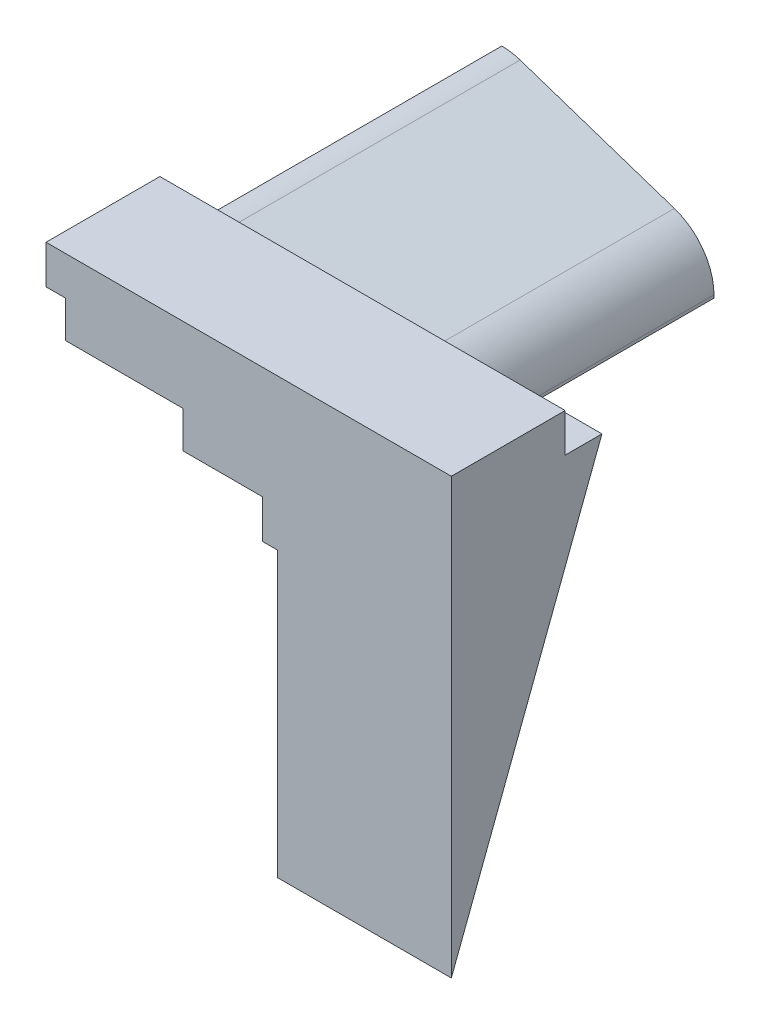
ISO-10303-21;
HEADER;
FILE_DESCRIPTION(('STEP AP214'),'2;1');
FILE_NAME('part.step','',(''),(''),'','','');
FILE_SCHEMA(('AUTOMOTIVE_DESIGN { 1 0 10303 214 1 1 1 1 }'));
ENDSEC;
DATA;
#1=APPLICATION_CONTEXT('core data for automotive mechanical design processes');
#2=APPLICATION_PROTOCOL_DEFINITION('international standard','automotive_design',2000,#1);
#3=PRODUCT_CONTEXT('',#1,'mechanical');
#4=PRODUCT('Part','Part','',(#3));
#5=PRODUCT_RELATED_PRODUCT_CATEGORY('part','',(#4));
#6=PRODUCT_DEFINITION_FORMATION('','',#4);
#7=PRODUCT_DEFINITION_CONTEXT('part definition',#1,'design');
#8=PRODUCT_DEFINITION('design','',#6,#7);
#9=PRODUCT_DEFINITION_SHAPE('','',#8);
#10=(LENGTH_UNIT() NAMED_UNIT(*) SI_UNIT(.MILLI.,.METRE.));
#11=(NAMED_UNIT(*) PLANE_ANGLE_UNIT() SI_UNIT($,.RADIAN.));
#12=(NAMED_UNIT(*) SI_UNIT($,.STERADIAN.) SOLID_ANGLE_UNIT());
#13=UNCERTAINTY_MEASURE_WITH_UNIT(LENGTH_MEASURE(1.E-05),#10,'distance_accuracy_value','');
#14=(GEOMETRIC_REPRESENTATION_CONTEXT(3) GLOBAL_UNCERTAINTY_ASSIGNED_CONTEXT((#13)) GLOBAL_UNIT_ASSIGNED_CONTEXT((#10,
#11,#12)) REPRESENTATION_CONTEXT('',''));
#15=CARTESIAN_POINT('',(0.,0.,0.));
#16=DIRECTION('',(0.,0.,1.));
#17=DIRECTION('',(1.,0.,0.));
#18=AXIS2_PLACEMENT_3D('',#15,#16,#17);
#19=CARTESIAN_POINT('',(300.,5.0000000000001,167.05));
#20=DIRECTION('',(0.,1.,0.));
#21=DIRECTION('',(0.,0.,1.));
#22=AXIS2_PLACEMENT_3D('',#19,#20,#21);
#23=PLANE('',#22);
#24=DIRECTION('',(0.,0.,1.));
#25=VECTOR('',#24,1.);
#26=CARTESIAN_POINT('',(100.131670194949,4.99999999999998,-345.933108931715));
#27=LINE('',#26,#25);
#28=CARTESIAN_POINT('',(100.131670194949,5.00000000000007,148.));
#29=VERTEX_POINT('',#28);
#30=CARTESIAN_POINT('',(100.131670194949,4.99999999999998,167.05));
#31=VERTEX_POINT('',#30);
#32=EDGE_CURVE('E204',#29,#31,#27,.T.);
#33=ORIENTED_EDGE('',*,*,#32,.T.);
#34=DIRECTION('',(1.,0.,0.));
#35=VECTOR('',#34,1.);
#36=CARTESIAN_POINT('',(300.,5.0000000000001,167.05));
#37=LINE('',#36,#35);
#38=CARTESIAN_POINT('',(300.,5.0000000000001,167.05));
#39=VERTEX_POINT('',#38);
#40=EDGE_CURVE('E213',#31,#39,#37,.T.);
#41=ORIENTED_EDGE('',*,*,#40,.T.);
#42=DIRECTION('',(0.,0.,-1.));
#43=VECTOR('',#42,1.);
#44=CARTESIAN_POINT('',(300.,5.0000000000001,167.05));
#45=LINE('',#44,#43);
#46=CARTESIAN_POINT('',(300.,5.0000000000001,148.));
#47=VERTEX_POINT('',#46);
#48=EDGE_CURVE('E205',#39,#47,#45,.T.);
#49=ORIENTED_EDGE('',*,*,#48,.T.);
#50=DIRECTION('',(-1.,0.,0.));
#51=VECTOR('',#50,1.);
#52=CARTESIAN_POINT('',(300.,5.0000000000001,148.));
#53=LINE('',#52,#51);
#54=EDGE_CURVE('E226',#47,#29,#53,.T.);
#55=ORIENTED_EDGE('',*,*,#54,.T.);
#56=EDGE_LOOP('',(#33,#41,#49,#55));
#57=FACE_BOUND('',#56,.T.);
#58=ADVANCED_FACE('F52',(#57),#23,.T.);
#59=CARTESIAN_POINT('',(0.,0.,167.05));
#60=DIRECTION('',(0.,0.,1.));
#61=DIRECTION('',(1.,0.,0.));
#62=AXIS2_PLACEMENT_3D('',#59,#60,#61);
#63=PLANE('',#62);
#64=DIRECTION('',(1.,0.,0.));
#65=VECTOR('',#64,1.);
#66=CARTESIAN_POINT('',(0.,25.0000000000001,167.05));
#67=LINE('',#66,#65);
#68=CARTESIAN_POINT('',(90.1316701949486,25.0000000000001,167.05));
#69=VERTEX_POINT('',#68);
#70=CARTESIAN_POINT('',(300.,25.0000000000001,167.05));
#71=VERTEX_POINT('',#70);
#72=EDGE_CURVE('E208',#69,#71,#67,.T.);
#73=ORIENTED_EDGE('',*,*,#72,.T.);
#74=DIRECTION('',(0.,1.,0.));
#75=VECTOR('',#74,1.);
#76=CARTESIAN_POINT('',(300.,5.0000000000001,167.05));
#77=LINE('',#76,#75);
#78=EDGE_CURVE('E104',#39,#71,#77,.T.);
#79=ORIENTED_EDGE('',*,*,#78,.F.);
#80=ORIENTED_EDGE('',*,*,#40,.F.);
#81=CARTESIAN_POINT('',(90.1316701949486,4.99999999999998,167.05));
#82=VERTEX_POINT('',#81);
#83=EDGE_CURVE('E210',#82,#31,#37,.T.);
#84=ORIENTED_EDGE('',*,*,#83,.F.);
#85=DIRECTION('',(0.,-1.,0.));
#86=VECTOR('',#85,1.);
#87=CARTESIAN_POINT('',(90.1316701949486,0.,167.05));
#88=LINE('',#87,#86);
#89=EDGE_CURVE('E186',#69,#82,#88,.T.);
#90=ORIENTED_EDGE('',*,*,#89,.F.);
#91=EDGE_LOOP('',(#73,#79,#80,#84,#90));
#92=FACE_BOUND('',#91,.T.);
#93=ADVANCED_FACE('F343',(#92),#63,.F.);
#94=CARTESIAN_POINT('',(300.,-200.,226.));
#95=DIRECTION('',(0.,-0.35561611887515,-0.934632107300073));
#96=DIRECTION('',(0.,0.934632107300073,-0.35561611887515));
#97=AXIS2_PLACEMENT_3D('',#94,#95,#96);
#98=PLANE('',#97);
#99=DIRECTION('',(-0.94188988136698,0.313963293788993,-0.119459204466056));
#100=VECTOR('',#99,1.);
#101=CARTESIAN_POINT('',(88.3474224434364,10.5508591855212,145.887965773314));
#102=LINE('',#101,#100);
#103=CARTESIAN_POINT('',(189.486832980505,-23.1622776601684,158.715403207284));
#104=VERTEX_POINT('',#103);
#105=CARTESIAN_POINT('',(109.618503175454,3.4604989415154,148.58576137835));
#106=VERTEX_POINT('',#105);
#107=EDGE_CURVE('E248',#104,#106,#102,.T.);
#108=ORIENTED_EDGE('',*,*,#107,.T.);
#109=CARTESIAN_POINT('',(100.131670194949,-25.,159.414634146341));
#110=DIRECTION('',(0.,-0.35561611887515,-0.934632107300073));
#111=DIRECTION('',(0.,0.934632107300073,-0.35561611887515));
#112=AXIS2_PLACEMENT_3D('',#109,#110,#111);
#113=ELLIPSE('',#112,32.0981911125039,30.);
#114=EDGE_CURVE('E230',#29,#106,#113,.T.);
#115=ORIENTED_EDGE('',*,*,#114,.F.);
#116=ORIENTED_EDGE('',*,*,#54,.F.);
#117=DIRECTION('',(0.,-0.934632107300073,0.35561611887515));
#118=VECTOR('',#117,1.);
#119=CARTESIAN_POINT('',(300.,-200.,226.));
#120=LINE('',#119,#118);
#121=CARTESIAN_POINT('',(300.,-200.,226.));
#122=VERTEX_POINT('',#121);
#123=EDGE_CURVE('E56',#47,#122,#120,.T.);
#124=ORIENTED_EDGE('',*,*,#123,.T.);
#125=DIRECTION('',(-1.,0.,0.));
#126=VECTOR('',#125,1.);
#127=CARTESIAN_POINT('',(300.,-200.,226.));
#128=LINE('',#127,#126);
#129=CARTESIAN_POINT('',(210.,-200.,226.));
#130=VERTEX_POINT('',#129);
#131=EDGE_CURVE('E254',#122,#130,#128,.T.);
#132=ORIENTED_EDGE('',*,*,#131,.T.);
#133=DIRECTION('',(0.,-0.934632107300073,0.35561611887515));
#134=VECTOR('',#133,1.);
#135=CARTESIAN_POINT('',(210.,49.823110020994,130.945353260305));
#136=LINE('',#135,#134);
#137=CARTESIAN_POINT('',(210.,-53.131468061771,170.118314677162));
#138=VERTEX_POINT('',#137);
#139=EDGE_CURVE('E87',#138,#130,#136,.T.);
#140=ORIENTED_EDGE('',*,*,#139,.F.);
#141=CARTESIAN_POINT('',(210.,-51.6227766016838,169.544275975275));
#142=VERTEX_POINT('',#141);
#143=EDGE_CURVE('E222',#142,#138,#136,.T.);
#144=ORIENTED_EDGE('',*,*,#143,.F.);
#145=CARTESIAN_POINT('',(180.,-51.6227766016838,169.544275975275));
#146=DIRECTION('',(0.,-0.35561611887515,-0.934632107300073));
#147=DIRECTION('',(0.,-0.934632107300073,0.35561611887515));
#148=AXIS2_PLACEMENT_3D('',#145,#146,#147);
#149=ELLIPSE('',#148,32.0981911125039,30.);
#150=EDGE_CURVE('E234',#104,#142,#149,.T.);
#151=ORIENTED_EDGE('',*,*,#150,.F.);
#152=EDGE_LOOP('',(#108,#115,#116,#124,#132,#140,#144,#151));
#153=FACE_BOUND('',#152,.T.);
#154=ADVANCED_FACE('F262',(#153),#98,.T.);
#155=CARTESIAN_POINT('',(105.,4.99999999999998,0.));
#156=DIRECTION('',(0.316227766016838,0.948683298050514,0.));
#157=DIRECTION('',(-0.948683298050514,0.316227766016838,0.));
#158=AXIS2_PLACEMENT_3D('',#155,#156,#157);
#159=PLANE('',#158);
#160=DIRECTION('',(-0.948683298050514,0.316227766016838,0.));
#161=VECTOR('',#160,1.);
#162=CARTESIAN_POINT('',(105.,4.99999999999998,0.));
#163=LINE('',#162,#161);
#164=CARTESIAN_POINT('',(189.486832980505,-23.1622776601684,0.));
#165=VERTEX_POINT('',#164);
#166=CARTESIAN_POINT('',(109.618503175454,3.46049894151539,0.));
#167=VERTEX_POINT('',#166);
#168=EDGE_CURVE('E225',#165,#167,#163,.T.);
#169=ORIENTED_EDGE('',*,*,#168,.T.);
#170=DIRECTION('',(0.,0.,1.));
#171=VECTOR('',#170,1.);
#172=CARTESIAN_POINT('',(109.618503175454,3.46049894151539,0.));
#173=LINE('',#172,#171);
#174=EDGE_CURVE('E245',#106,#167,#173,.F.);
#175=ORIENTED_EDGE('',*,*,#174,.F.);
#176=ORIENTED_EDGE('',*,*,#107,.F.);
#177=DIRECTION('',(0.,0.,1.));
#178=VECTOR('',#177,1.);
#179=CARTESIAN_POINT('',(189.486832980505,-23.1622776601684,0.));
#180=LINE('',#179,#178);
#181=EDGE_CURVE('E242',#165,#104,#180,.T.);
#182=ORIENTED_EDGE('',*,*,#181,.F.);
#183=EDGE_LOOP('',(#169,#175,#176,#182));
#184=FACE_BOUND('',#183,.T.);
#185=ADVANCED_FACE('F370',(#184),#159,.T.);
#186=CARTESIAN_POINT('',(180.,-51.6227766016838,0.));
#187=DIRECTION('',(0.,0.,1.));
#188=DIRECTION('',(1.,0.,0.));
#189=AXIS2_PLACEMENT_3D('',#186,#187,#188);
#190=CYLINDRICAL_SURFACE('',#189,30.);
#191=CARTESIAN_POINT('',(180.,-51.6227766016838,0.));
#192=DIRECTION('',(0.,0.,1.));
#193=DIRECTION('',(1.,0.,0.));
#194=AXIS2_PLACEMENT_3D('',#191,#192,#193);
#195=CIRCLE('',#194,30.);
#196=CARTESIAN_POINT('',(210.,-51.6227766016838,0.));
#197=VERTEX_POINT('',#196);
#198=EDGE_CURVE('E95',#197,#165,#195,.T.);
#199=ORIENTED_EDGE('',*,*,#198,.T.);
#200=ORIENTED_EDGE('',*,*,#181,.T.);
#201=ORIENTED_EDGE('',*,*,#150,.T.);
#202=DIRECTION('',(0.,0.,1.));
#203=VECTOR('',#202,1.);
#204=CARTESIAN_POINT('',(210.,-51.6227766016838,0.));
#205=LINE('',#204,#203);
#206=EDGE_CURVE('E240',#142,#197,#205,.F.);
#207=ORIENTED_EDGE('',*,*,#206,.T.);
#208=EDGE_LOOP('',(#199,#200,#201,#207));
#209=FACE_BOUND('',#208,.T.);
#210=ADVANCED_FACE('F375',(#209),#190,.T.);
#211=CARTESIAN_POINT('',(210.,0.,0.));
#212=DIRECTION('',(-1.,0.,0.));
#213=DIRECTION('',(0.,-1.,0.));
#214=AXIS2_PLACEMENT_3D('',#211,#212,#213);
#215=PLANE('',#214);
#216=DIRECTION('',(0.,-1.,0.));
#217=VECTOR('',#216,1.);
#218=CARTESIAN_POINT('',(210.,0.,0.));
#219=LINE('',#218,#217);
#220=CARTESIAN_POINT('',(210.,-53.1314680617709,0.));
#221=VERTEX_POINT('',#220);
#222=EDGE_CURVE('E197',#197,#221,#219,.T.);
#223=ORIENTED_EDGE('',*,*,#222,.F.);
#224=ORIENTED_EDGE('',*,*,#206,.F.);
#225=ORIENTED_EDGE('',*,*,#143,.T.);
#226=DIRECTION('',(0.,0.,1.));
#227=VECTOR('',#226,1.);
#228=CARTESIAN_POINT('',(210.,-53.1314680617709,-345.933108931715));
#229=LINE('',#228,#227);
#230=EDGE_CURVE('E199',#221,#138,#229,.T.);
#231=ORIENTED_EDGE('',*,*,#230,.F.);
#232=EDGE_LOOP('',(#223,#224,#225,#231));
#233=FACE_BOUND('',#232,.T.);
#234=ADVANCED_FACE('F54',(#233),#215,.F.);
#235=CARTESIAN_POINT('',(100.131670194949,-25.,0.));
#236=DIRECTION('',(0.,0.,-1.));
#237=DIRECTION('',(-1.,0.,0.));
#238=AXIS2_PLACEMENT_3D('',#235,#236,#237);
#239=CYLINDRICAL_SURFACE('',#238,30.);
#240=CARTESIAN_POINT('',(100.131670194949,-25.,0.));
#241=DIRECTION('',(0.,0.,1.));
#242=DIRECTION('',(1.,0.,0.));
#243=AXIS2_PLACEMENT_3D('',#240,#241,#242);
#244=CIRCLE('',#243,30.);
#245=CARTESIAN_POINT('',(100.131670194949,4.99999999999998,0.));
#246=VERTEX_POINT('',#245);
#247=EDGE_CURVE('E227',#167,#246,#244,.T.);
#248=ORIENTED_EDGE('',*,*,#247,.T.);
#249=DIRECTION('',(0.,0.,1.));
#250=VECTOR('',#249,1.);
#251=CARTESIAN_POINT('',(100.131670194949,4.99999999999998,148.));
#252=LINE('',#251,#250);
#253=EDGE_CURVE('E237',#246,#29,#252,.T.);
#254=ORIENTED_EDGE('',*,*,#253,.T.);
#255=ORIENTED_EDGE('',*,*,#114,.T.);
#256=ORIENTED_EDGE('',*,*,#174,.T.);
#257=EDGE_LOOP('',(#248,#254,#255,#256));
#258=FACE_BOUND('',#257,.T.);
#259=ADVANCED_FACE('F357',(#258),#239,.T.);
#260=CARTESIAN_POINT('',(0.,4.99999999999998,-345.933108931715));
#261=DIRECTION('',(0.,1.,0.));
#262=DIRECTION('',(0.,0.,-1.));
#263=AXIS2_PLACEMENT_3D('',#260,#261,#262);
#264=PLANE('',#263);
#265=DIRECTION('',(0.,0.,1.));
#266=VECTOR('',#265,1.);
#267=CARTESIAN_POINT('',(90.1316701949486,4.99999999999998,-345.933108931715));
#268=LINE('',#267,#266);
#269=CARTESIAN_POINT('',(90.1316701949486,4.99999999999998,226.));
#270=VERTEX_POINT('',#269);
#271=EDGE_CURVE('E202',#82,#270,#268,.T.);
#272=ORIENTED_EDGE('',*,*,#271,.F.);
#273=ORIENTED_EDGE('',*,*,#83,.T.);
#274=CARTESIAN_POINT('',(100.131670194949,4.99999999999998,226.));
#275=VERTEX_POINT('',#274);
#276=EDGE_CURVE('E200',#31,#275,#27,.T.);
#277=ORIENTED_EDGE('',*,*,#276,.T.);
#278=DIRECTION('',(-1.,0.,0.));
#279=VECTOR('',#278,1.);
#280=CARTESIAN_POINT('',(0.,4.99999999999998,226.));
#281=LINE('',#280,#279);
#282=EDGE_CURVE('E283',#275,#270,#281,.T.);
#283=ORIENTED_EDGE('',*,*,#282,.T.);
#284=EDGE_LOOP('',(#272,#273,#277,#283));
#285=FACE_BOUND('',#284,.T.);
#286=ADVANCED_FACE('F341',(#285),#264,.F.);
#287=CARTESIAN_POINT('',(90.1316701949486,0.,-345.933108931715));
#288=DIRECTION('',(1.,0.,0.));
#289=DIRECTION('',(0.,0.,-1.));
#290=AXIS2_PLACEMENT_3D('',#287,#288,#289);
#291=PLANE('',#290);
#292=DIRECTION('',(0.,0.,1.));
#293=VECTOR('',#292,1.);
#294=CARTESIAN_POINT('',(90.1316701949486,25.0000000000001,-345.933108931715));
#295=LINE('',#294,#293);
#296=CARTESIAN_POINT('',(90.1316701949486,25.0000000000001,226.));
#297=VERTEX_POINT('',#296);
#298=EDGE_CURVE('E219',#69,#297,#295,.T.);
#299=ORIENTED_EDGE('',*,*,#298,.F.);
#300=ORIENTED_EDGE('',*,*,#89,.T.);
#301=ORIENTED_EDGE('',*,*,#271,.T.);
#302=DIRECTION('',(0.,1.,0.));
#303=VECTOR('',#302,1.);
#304=CARTESIAN_POINT('',(90.1316701949486,0.,226.));
#305=LINE('',#304,#303);
#306=EDGE_CURVE('E275',#270,#297,#305,.T.);
#307=ORIENTED_EDGE('',*,*,#306,.T.);
#308=EDGE_LOOP('',(#299,#300,#301,#307));
#309=FACE_BOUND('',#308,.T.);
#310=ADVANCED_FACE('F349',(#309),#291,.F.);
#311=CARTESIAN_POINT('',(100.131670194949,0.,-345.933108931715));
#312=DIRECTION('',(1.,0.,0.));
#313=DIRECTION('',(0.,0.,-1.));
#314=AXIS2_PLACEMENT_3D('',#311,#312,#313);
#315=PLANE('',#314);
#316=ORIENTED_EDGE('',*,*,#253,.F.);
#317=DIRECTION('',(0.,-1.,0.));
#318=VECTOR('',#317,1.);
#319=CARTESIAN_POINT('',(100.131670194949,0.,0.));
#320=LINE('',#319,#318);
#321=CARTESIAN_POINT('',(100.131670194949,-14.05,0.));
#322=VERTEX_POINT('',#321);
#323=EDGE_CURVE('E194',#246,#322,#320,.T.);
#324=ORIENTED_EDGE('',*,*,#323,.T.);
#325=DIRECTION('',(0.,0.,1.));
#326=VECTOR('',#325,1.);
#327=CARTESIAN_POINT('',(100.131670194949,-14.05,-345.933108931715));
#328=LINE('',#327,#326);
#329=CARTESIAN_POINT('',(100.131670194949,-14.05,226.));
#330=VERTEX_POINT('',#329);
#331=EDGE_CURVE('E203',#322,#330,#328,.T.);
#332=ORIENTED_EDGE('',*,*,#331,.T.);
#333=DIRECTION('',(0.,1.,0.));
#334=VECTOR('',#333,1.);
#335=CARTESIAN_POINT('',(100.131670194949,0.,226.));
#336=LINE('',#335,#334);
#337=EDGE_CURVE('E286',#330,#275,#336,.T.);
#338=ORIENTED_EDGE('',*,*,#337,.T.);
#339=ORIENTED_EDGE('',*,*,#276,.F.);
#340=ORIENTED_EDGE('',*,*,#32,.F.);
#341=EDGE_LOOP('',(#316,#324,#332,#338,#339,#340));
#342=FACE_BOUND('',#341,.T.);
#343=ADVANCED_FACE('F296',(#342),#315,.F.);
#344=CARTESIAN_POINT('',(0.,-14.05,-345.933108931715));
#345=DIRECTION('',(0.,1.,0.));
#346=DIRECTION('',(1.,0.,0.));
#347=AXIS2_PLACEMENT_3D('',#344,#345,#346);
#348=PLANE('',#347);
#349=ORIENTED_EDGE('',*,*,#331,.F.);
#350=DIRECTION('',(1.,0.,0.));
#351=VECTOR('',#350,1.);
#352=CARTESIAN_POINT('',(0.,-14.05,0.));
#353=LINE('',#352,#351);
#354=CARTESIAN_POINT('',(161.15,-14.05,0.));
#355=VERTEX_POINT('',#354);
#356=EDGE_CURVE('E191',#322,#355,#353,.T.);
#357=ORIENTED_EDGE('',*,*,#356,.T.);
#358=DIRECTION('',(0.,0.,1.));
#359=VECTOR('',#358,1.);
#360=CARTESIAN_POINT('',(161.15,-14.05,-345.933108931715));
#361=LINE('',#360,#359);
#362=CARTESIAN_POINT('',(161.15,-14.05,226.));
#363=VERTEX_POINT('',#362);
#364=EDGE_CURVE('E164',#355,#363,#361,.T.);
#365=ORIENTED_EDGE('',*,*,#364,.T.);
#366=DIRECTION('',(-1.,0.,0.));
#367=VECTOR('',#366,1.);
#368=CARTESIAN_POINT('',(0.,-14.05,226.));
#369=LINE('',#368,#367);
#370=EDGE_CURVE('E174',#363,#330,#369,.T.);
#371=ORIENTED_EDGE('',*,*,#370,.T.);
#372=EDGE_LOOP('',(#349,#357,#365,#371));
#373=FACE_BOUND('',#372,.T.);
#374=ADVANCED_FACE('F290',(#373),#348,.F.);
#375=CARTESIAN_POINT('',(161.15,0.,-345.933108931715));
#376=DIRECTION('',(1.,0.,0.));
#377=DIRECTION('',(0.,0.,-1.));
#378=AXIS2_PLACEMENT_3D('',#375,#376,#377);
#379=PLANE('',#378);
#380=ORIENTED_EDGE('',*,*,#364,.F.);
#381=DIRECTION('',(0.,-1.,0.));
#382=VECTOR('',#381,1.);
#383=CARTESIAN_POINT('',(161.15,0.,0.));
#384=LINE('',#383,#382);
#385=CARTESIAN_POINT('',(161.15,-33.1,0.));
#386=VERTEX_POINT('',#385);
#387=EDGE_CURVE('E160',#355,#386,#384,.T.);
#388=ORIENTED_EDGE('',*,*,#387,.T.);
#389=DIRECTION('',(0.,0.,1.));
#390=VECTOR('',#389,1.);
#391=CARTESIAN_POINT('',(161.15,-33.1,-345.933108931715));
#392=LINE('',#391,#390);
#393=CARTESIAN_POINT('',(161.15,-33.1,226.));
#394=VERTEX_POINT('',#393);
#395=EDGE_CURVE('E154',#386,#394,#392,.T.);
#396=ORIENTED_EDGE('',*,*,#395,.T.);
#397=DIRECTION('',(0.,1.,0.));
#398=VECTOR('',#397,1.);
#399=CARTESIAN_POINT('',(161.15,0.,226.));
#400=LINE('',#399,#398);
#401=EDGE_CURVE('E158',#394,#363,#400,.T.);
#402=ORIENTED_EDGE('',*,*,#401,.T.);
#403=EDGE_LOOP('',(#380,#388,#396,#402));
#404=FACE_BOUND('',#403,.T.);
#405=ADVANCED_FACE('F157',(#404),#379,.F.);
#406=CARTESIAN_POINT('',(0.,-33.1,-345.933108931715));
#407=DIRECTION('',(0.,-1.,0.));
#408=DIRECTION('',(0.,0.,1.));
#409=AXIS2_PLACEMENT_3D('',#406,#407,#408);
#410=PLANE('',#409);
#411=DIRECTION('',(-1.,0.,0.));
#412=VECTOR('',#411,1.);
#413=CARTESIAN_POINT('',(0.,-33.1,0.));
#414=LINE('',#413,#412);
#415=CARTESIAN_POINT('',(202.337265555267,-33.1,0.));
#416=VERTEX_POINT('',#415);
#417=EDGE_CURVE('E188',#416,#386,#414,.T.);
#418=ORIENTED_EDGE('',*,*,#417,.F.);
#419=DIRECTION('',(0.,0.,1.));
#420=VECTOR('',#419,1.);
#421=CARTESIAN_POINT('',(202.337265555267,-33.1,-345.933108931715));
#422=LINE('',#421,#420);
#423=CARTESIAN_POINT('',(202.337265555267,-33.1,226.));
#424=VERTEX_POINT('',#423);
#425=EDGE_CURVE('E165',#416,#424,#422,.T.);
#426=ORIENTED_EDGE('',*,*,#425,.T.);
#427=DIRECTION('',(1.,0.,0.));
#428=VECTOR('',#427,1.);
#429=CARTESIAN_POINT('',(0.,-33.1,226.));
#430=LINE('',#429,#428);
#431=EDGE_CURVE('E171',#394,#424,#430,.T.);
#432=ORIENTED_EDGE('',*,*,#431,.F.);
#433=ORIENTED_EDGE('',*,*,#395,.F.);
#434=EDGE_LOOP('',(#418,#426,#432,#433));
#435=FACE_BOUND('',#434,.T.);
#436=ADVANCED_FACE('F176',(#435),#410,.T.);
#437=CARTESIAN_POINT('',(0.,0.,0.));
#438=DIRECTION('',(0.,0.,1.));
#439=DIRECTION('',(1.,0.,0.));
#440=AXIS2_PLACEMENT_3D('',#437,#438,#439);
#441=PLANE('',#440);
#442=ORIENTED_EDGE('',*,*,#247,.F.);
#443=ORIENTED_EDGE('',*,*,#168,.F.);
#444=ORIENTED_EDGE('',*,*,#198,.F.);
#445=ORIENTED_EDGE('',*,*,#222,.T.);
#446=DIRECTION('',(1.,0.,0.));
#447=VECTOR('',#446,1.);
#448=CARTESIAN_POINT('',(0.,-53.1314680617706,0.));
#449=LINE('',#448,#447);
#450=CARTESIAN_POINT('',(202.337265555267,-53.1314680617709,0.));
#451=VERTEX_POINT('',#450);
#452=EDGE_CURVE('E182',#451,#221,#449,.T.);
#453=ORIENTED_EDGE('',*,*,#452,.F.);
#454=DIRECTION('',(0.,-1.,0.));
#455=VECTOR('',#454,1.);
#456=CARTESIAN_POINT('',(202.337265555267,0.,0.));
#457=LINE('',#456,#455);
#458=EDGE_CURVE('E185',#416,#451,#457,.T.);
#459=ORIENTED_EDGE('',*,*,#458,.F.);
#460=ORIENTED_EDGE('',*,*,#417,.T.);
#461=ORIENTED_EDGE('',*,*,#387,.F.);
#462=ORIENTED_EDGE('',*,*,#356,.F.);
#463=ORIENTED_EDGE('',*,*,#323,.F.);
#464=EDGE_LOOP('',(#442,#443,#444,#445,#453,#459,#460,#461,#462,#463));
#465=FACE_BOUND('',#464,.T.);
#466=ADVANCED_FACE('F311',(#465),#441,.F.);
#467=CARTESIAN_POINT('',(202.337265555267,0.,-345.933108931715));
#468=DIRECTION('',(1.,0.,0.));
#469=DIRECTION('',(0.,0.,-1.));
#470=AXIS2_PLACEMENT_3D('',#467,#468,#469);
#471=PLANE('',#470);
#472=ORIENTED_EDGE('',*,*,#425,.F.);
#473=ORIENTED_EDGE('',*,*,#458,.T.);
#474=DIRECTION('',(0.,0.,1.));
#475=VECTOR('',#474,1.);
#476=CARTESIAN_POINT('',(202.337265555267,-53.1314680617709,-345.933108931715));
#477=LINE('',#476,#475);
#478=CARTESIAN_POINT('',(202.337265555267,-53.1314680617709,226.));
#479=VERTEX_POINT('',#478);
#480=EDGE_CURVE('E71',#451,#479,#477,.T.);
#481=ORIENTED_EDGE('',*,*,#480,.T.);
#482=DIRECTION('',(0.,1.,0.));
#483=VECTOR('',#482,1.);
#484=CARTESIAN_POINT('',(202.337265555267,0.,226.));
#485=LINE('',#484,#483);
#486=EDGE_CURVE('E62',#479,#424,#485,.T.);
#487=ORIENTED_EDGE('',*,*,#486,.T.);
#488=EDGE_LOOP('',(#472,#473,#481,#487));
#489=FACE_BOUND('',#488,.T.);
#490=ADVANCED_FACE('F308',(#489),#471,.F.);
#491=CARTESIAN_POINT('',(0.,0.,226.));
#492=DIRECTION('',(0.,0.,-1.));
#493=DIRECTION('',(-1.,0.,0.));
#494=AXIS2_PLACEMENT_3D('',#491,#492,#493);
#495=PLANE('',#494);
#496=ORIENTED_EDGE('',*,*,#131,.F.);
#497=DIRECTION('',(0.,1.,0.));
#498=VECTOR('',#497,1.);
#499=CARTESIAN_POINT('',(300.,0.,226.));
#500=LINE('',#499,#498);
#501=CARTESIAN_POINT('',(300.,25.0000000000001,226.));
#502=VERTEX_POINT('',#501);
#503=EDGE_CURVE('E267',#122,#502,#500,.T.);
#504=ORIENTED_EDGE('',*,*,#503,.T.);
#505=DIRECTION('',(-1.,0.,0.));
#506=VECTOR('',#505,1.);
#507=CARTESIAN_POINT('',(0.,25.0000000000001,226.));
#508=LINE('',#507,#506);
#509=EDGE_CURVE('E272',#502,#297,#508,.T.);
#510=ORIENTED_EDGE('',*,*,#509,.T.);
#511=ORIENTED_EDGE('',*,*,#306,.F.);
#512=ORIENTED_EDGE('',*,*,#282,.F.);
#513=ORIENTED_EDGE('',*,*,#337,.F.);
#514=ORIENTED_EDGE('',*,*,#370,.F.);
#515=ORIENTED_EDGE('',*,*,#401,.F.);
#516=ORIENTED_EDGE('',*,*,#431,.T.);
#517=ORIENTED_EDGE('',*,*,#486,.F.);
#518=DIRECTION('',(-1.,0.,0.));
#519=VECTOR('',#518,1.);
#520=CARTESIAN_POINT('',(0.,-53.1314680617706,226.));
#521=LINE('',#520,#519);
#522=CARTESIAN_POINT('',(210.,-53.1314680617709,226.));
#523=VERTEX_POINT('',#522);
#524=EDGE_CURVE('E11',#523,#479,#521,.T.);
#525=ORIENTED_EDGE('',*,*,#524,.F.);
#526=DIRECTION('',(0.,1.,0.));
#527=VECTOR('',#526,1.);
#528=CARTESIAN_POINT('',(210.,0.,226.));
#529=LINE('',#528,#527);
#530=EDGE_CURVE('E273',#130,#523,#529,.T.);
#531=ORIENTED_EDGE('',*,*,#530,.F.);
#532=EDGE_LOOP('',(#496,#504,#510,#511,#512,#513,#514,#515,#516,#517,#525,#531));
#533=FACE_BOUND('',#532,.T.);
#534=ADVANCED_FACE('F170',(#533),#495,.F.);
#535=CARTESIAN_POINT('',(0.,-53.1314680617706,-345.933108931715));
#536=DIRECTION('',(0.,1.,0.));
#537=DIRECTION('',(1.,0.,0.));
#538=AXIS2_PLACEMENT_3D('',#535,#536,#537);
#539=PLANE('',#538);
#540=ORIENTED_EDGE('',*,*,#480,.F.);
#541=ORIENTED_EDGE('',*,*,#452,.T.);
#542=ORIENTED_EDGE('',*,*,#230,.T.);
#543=EDGE_CURVE('E218',#138,#523,#229,.T.);
#544=ORIENTED_EDGE('',*,*,#543,.T.);
#545=ORIENTED_EDGE('',*,*,#524,.T.);
#546=EDGE_LOOP('',(#540,#541,#542,#544,#545));
#547=FACE_BOUND('',#546,.T.);
#548=ADVANCED_FACE('F304',(#547),#539,.F.);
#549=CARTESIAN_POINT('',(210.,0.,-345.933108931715));
#550=DIRECTION('',(1.,0.,0.));
#551=DIRECTION('',(0.,-1.,0.));
#552=AXIS2_PLACEMENT_3D('',#549,#550,#551);
#553=PLANE('',#552);
#554=ORIENTED_EDGE('',*,*,#543,.F.);
#555=ORIENTED_EDGE('',*,*,#139,.T.);
#556=ORIENTED_EDGE('',*,*,#530,.T.);
#557=EDGE_LOOP('',(#554,#555,#556));
#558=FACE_BOUND('',#557,.T.);
#559=ADVANCED_FACE('F307',(#558),#553,.F.);
#560=CARTESIAN_POINT('',(0.,25.0000000000001,-345.933108931715));
#561=DIRECTION('',(0.,1.,0.));
#562=DIRECTION('',(0.,0.,-1.));
#563=AXIS2_PLACEMENT_3D('',#560,#561,#562);
#564=PLANE('',#563);
#565=ORIENTED_EDGE('',*,*,#72,.F.);
#566=ORIENTED_EDGE('',*,*,#298,.T.);
#567=ORIENTED_EDGE('',*,*,#509,.F.);
#568=DIRECTION('',(0.,0.,1.));
#569=VECTOR('',#568,1.);
#570=CARTESIAN_POINT('',(300.,25.0000000000001,-345.933108931715));
#571=LINE('',#570,#569);
#572=EDGE_CURVE('E216',#71,#502,#571,.T.);
#573=ORIENTED_EDGE('',*,*,#572,.F.);
#574=EDGE_LOOP('',(#565,#566,#567,#573));
#575=FACE_BOUND('',#574,.T.);
#576=ADVANCED_FACE('F347',(#575),#564,.T.);
#577=CARTESIAN_POINT('',(300.,0.,-345.933108931715));
#578=DIRECTION('',(1.,0.,0.));
#579=DIRECTION('',(0.,0.,-1.));
#580=AXIS2_PLACEMENT_3D('',#577,#578,#579);
#581=PLANE('',#580);
#582=ORIENTED_EDGE('',*,*,#123,.F.);
#583=ORIENTED_EDGE('',*,*,#48,.F.);
#584=ORIENTED_EDGE('',*,*,#78,.T.);
#585=ORIENTED_EDGE('',*,*,#572,.T.);
#586=ORIENTED_EDGE('',*,*,#503,.F.);
#587=EDGE_LOOP('',(#582,#583,#584,#585,#586));
#588=FACE_BOUND('',#587,.T.);
#589=ADVANCED_FACE('F268',(#588),#581,.T.);
#590=CLOSED_SHELL('',(#58,#93,#154,#185,#210,#234,#259,#286,#310,#343,#374,#405,#436,#466,#490,
#534,#548,#559,#576,#589));
#591=MANIFOLD_SOLID_BREP('B2',#590);
#592=ADVANCED_BREP_SHAPE_REPRESENTATION('',(#18,#591),#14);
#593=SHAPE_DEFINITION_REPRESENTATION(#9,#592);
ENDSEC;
END-ISO-10303-21;
